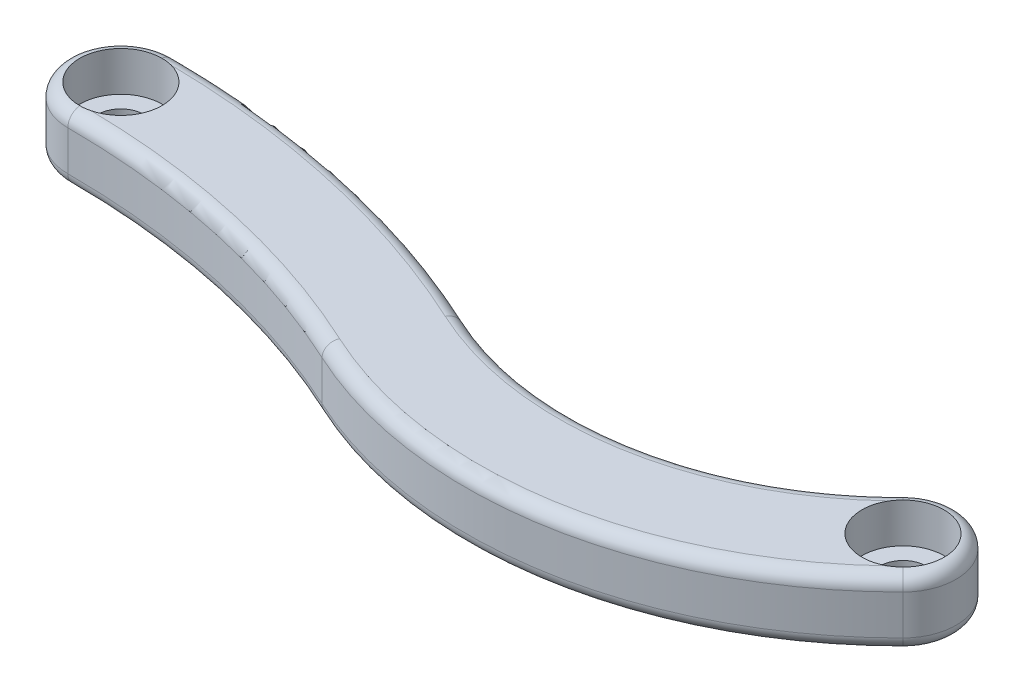
ISO-10303-21;
HEADER;
FILE_DESCRIPTION(('STEP AP214'),'2;1');
FILE_NAME('part.step','',(''),(''),'','','');
FILE_SCHEMA(('AUTOMOTIVE_DESIGN { 1 0 10303 214 1 1 1 1 }'));
ENDSEC;
DATA;
#1=APPLICATION_CONTEXT('core data for automotive mechanical design processes');
#2=APPLICATION_PROTOCOL_DEFINITION('international standard','automotive_design',2000,#1);
#3=PRODUCT_CONTEXT('',#1,'mechanical');
#4=PRODUCT('Part','Part','',(#3));
#5=PRODUCT_RELATED_PRODUCT_CATEGORY('part','',(#4));
#6=PRODUCT_DEFINITION_FORMATION('','',#4);
#7=PRODUCT_DEFINITION_CONTEXT('part definition',#1,'design');
#8=PRODUCT_DEFINITION('design','',#6,#7);
#9=PRODUCT_DEFINITION_SHAPE('','',#8);
#10=(LENGTH_UNIT() NAMED_UNIT(*) SI_UNIT(.MILLI.,.METRE.));
#11=(NAMED_UNIT(*) PLANE_ANGLE_UNIT() SI_UNIT($,.RADIAN.));
#12=(NAMED_UNIT(*) SI_UNIT($,.STERADIAN.) SOLID_ANGLE_UNIT());
#13=UNCERTAINTY_MEASURE_WITH_UNIT(LENGTH_MEASURE(1.E-05),#10,'distance_accuracy_value','');
#14=(GEOMETRIC_REPRESENTATION_CONTEXT(3) GLOBAL_UNCERTAINTY_ASSIGNED_CONTEXT((#13)) GLOBAL_UNIT_ASSIGNED_CONTEXT((#10,
#11,#12)) REPRESENTATION_CONTEXT('',''));
#15=CARTESIAN_POINT('',(0.,0.,0.));
#16=DIRECTION('',(0.,0.,1.));
#17=DIRECTION('',(1.,0.,0.));
#18=AXIS2_PLACEMENT_3D('',#15,#16,#17);
#19=CARTESIAN_POINT('',(-29.5,-25.,0.));
#20=DIRECTION('',(0.,1.,0.));
#21=DIRECTION('',(0.,0.,-1.));
#22=AXIS2_PLACEMENT_3D('',#19,#20,#21);
#23=CYLINDRICAL_SURFACE('',#22,1.75);
#24=CARTESIAN_POINT('',(-29.5,-25.,0.));
#25=DIRECTION('',(0.,1.,0.));
#26=DIRECTION('',(0.,0.,1.));
#27=AXIS2_PLACEMENT_3D('',#24,#25,#26);
#28=CIRCLE('',#27,1.75);
#29=CARTESIAN_POINT('',(-29.5,-25.,1.75));
#30=VERTEX_POINT('',#29);
#31=EDGE_CURVE('E243',#30,#30,#28,.T.);
#32=ORIENTED_EDGE('',*,*,#31,.F.);
#33=EDGE_LOOP('',(#32));
#34=FACE_BOUND('',#33,.T.);
#35=CARTESIAN_POINT('',(-29.5,-23.,0.));
#36=DIRECTION('',(0.,-1.,0.));
#37=DIRECTION('',(0.,0.,-1.));
#38=AXIS2_PLACEMENT_3D('',#35,#36,#37);
#39=CIRCLE('',#38,1.75);
#40=CARTESIAN_POINT('',(-29.5,-23.,-1.75));
#41=VERTEX_POINT('',#40);
#42=EDGE_CURVE('E43',#41,#41,#39,.T.);
#43=ORIENTED_EDGE('',*,*,#42,.F.);
#44=EDGE_LOOP('',(#43));
#45=FACE_BOUND('',#44,.T.);
#46=ADVANCED_FACE('F39',(#34,#45),#23,.F.);
#47=CARTESIAN_POINT('',(29.5,-25.,0.));
#48=DIRECTION('',(0.,1.,0.));
#49=DIRECTION('',(0.,0.,-1.));
#50=AXIS2_PLACEMENT_3D('',#47,#48,#49);
#51=CYLINDRICAL_SURFACE('',#50,1.75);
#52=CARTESIAN_POINT('',(29.5,-25.,0.));
#53=DIRECTION('',(0.,1.,0.));
#54=DIRECTION('',(0.,0.,1.));
#55=AXIS2_PLACEMENT_3D('',#52,#53,#54);
#56=CIRCLE('',#55,1.75);
#57=CARTESIAN_POINT('',(29.5,-25.,1.75));
#58=VERTEX_POINT('',#57);
#59=EDGE_CURVE('E239',#58,#58,#56,.T.);
#60=ORIENTED_EDGE('',*,*,#59,.F.);
#61=EDGE_LOOP('',(#60));
#62=FACE_BOUND('',#61,.T.);
#63=CARTESIAN_POINT('',(29.5,-23.,0.));
#64=DIRECTION('',(0.,-1.,0.));
#65=DIRECTION('',(0.,0.,-1.));
#66=AXIS2_PLACEMENT_3D('',#63,#64,#65);
#67=CIRCLE('',#66,1.75);
#68=CARTESIAN_POINT('',(29.5,-23.,-1.75));
#69=VERTEX_POINT('',#68);
#70=EDGE_CURVE('E221',#69,#69,#67,.T.);
#71=ORIENTED_EDGE('',*,*,#70,.F.);
#72=EDGE_LOOP('',(#71));
#73=FACE_BOUND('',#72,.T.);
#74=ADVANCED_FACE('F228',(#62,#73),#51,.F.);
#75=CARTESIAN_POINT('',(-10.253048327205,-25.,20.9834913295184));
#76=DIRECTION('',(0.,1.,0.));
#77=DIRECTION('',(0.,0.,-1.));
#78=AXIS2_PLACEMENT_3D('',#75,#76,#77);
#79=PLANE('',#78);
#80=CARTESIAN_POINT('',(8.99390334559,-25.,-20.5060966544098));
#81=DIRECTION('',(0.,-1.,0.));
#82=DIRECTION('',(0.,0.,-1.));
#83=AXIS2_PLACEMENT_3D('',#80,#81,#82);
#84=CIRCLE('',#83,32.);
#85=CARTESIAN_POINT('',(-4.47240735810798,-25.,8.52248367655837));
#86=VERTEX_POINT('',#85);
#87=CARTESIAN_POINT('',(31.6213203435597,-25.,2.12132034355962));
#88=VERTEX_POINT('',#87);
#89=EDGE_CURVE('E288',#86,#88,#84,.F.);
#90=ORIENTED_EDGE('',*,*,#89,.F.);
#91=CARTESIAN_POINT('',(-29.5,-25.,62.4730793134466));
#92=DIRECTION('',(0.,-1.,0.));
#93=DIRECTION('',(0.,0.,-1.));
#94=AXIS2_PLACEMENT_3D('',#91,#92,#93);
#95=CIRCLE('',#94,59.4730793134466);
#96=CARTESIAN_POINT('',(-29.5,-25.,3.));
#97=VERTEX_POINT('',#96);
#98=EDGE_CURVE('E284',#97,#86,#95,.T.);
#99=ORIENTED_EDGE('',*,*,#98,.F.);
#100=CARTESIAN_POINT('',(-29.5,-25.,0.));
#101=DIRECTION('',(0.,-1.,0.));
#102=DIRECTION('',(0.,0.,-1.));
#103=AXIS2_PLACEMENT_3D('',#100,#101,#102);
#104=CIRCLE('',#103,3.);
#105=CARTESIAN_POINT('',(-29.5,-25.,-3.));
#106=VERTEX_POINT('',#105);
#107=EDGE_CURVE('E280',#106,#97,#104,.F.);
#108=ORIENTED_EDGE('',*,*,#107,.F.);
#109=CARTESIAN_POINT('',(-29.5,-25.,62.4730793134467));
#110=DIRECTION('',(0.,-1.,0.));
#111=DIRECTION('',(0.,0.,-1.));
#112=AXIS2_PLACEMENT_3D('',#109,#110,#111);
#113=CIRCLE('',#112,65.4730793134467);
#114=CARTESIAN_POINT('',(-1.94747410116464,-25.,3.07962486450185));
#115=VERTEX_POINT('',#114);
#116=EDGE_CURVE('E276',#115,#106,#113,.F.);
#117=ORIENTED_EDGE('',*,*,#116,.F.);
#118=CARTESIAN_POINT('',(8.99390334558998,-25.,-20.5060966544098));
#119=DIRECTION('',(0.,-1.,0.));
#120=DIRECTION('',(0.,0.,-1.));
#121=AXIS2_PLACEMENT_3D('',#118,#119,#120);
#122=CIRCLE('',#121,26.);
#123=CARTESIAN_POINT('',(27.3786796564403,-25.,-2.12132034355963));
#124=VERTEX_POINT('',#123);
#125=EDGE_CURVE('E272',#124,#115,#122,.T.);
#126=ORIENTED_EDGE('',*,*,#125,.F.);
#127=CARTESIAN_POINT('',(29.5,-25.,0.));
#128=DIRECTION('',(0.,-1.,0.));
#129=DIRECTION('',(0.,0.,-1.));
#130=AXIS2_PLACEMENT_3D('',#127,#128,#129);
#131=CIRCLE('',#130,3.);
#132=EDGE_CURVE('E292',#88,#124,#131,.F.);
#133=ORIENTED_EDGE('',*,*,#132,.F.);
#134=EDGE_LOOP('',(#90,#99,#108,#117,#126,#133));
#135=FACE_BOUND('',#134,.T.);
#136=ORIENTED_EDGE('',*,*,#31,.T.);
#137=EDGE_LOOP('',(#136));
#138=FACE_BOUND('',#137,.T.);
#139=ORIENTED_EDGE('',*,*,#59,.T.);
#140=EDGE_LOOP('',(#139));
#141=FACE_BOUND('',#140,.T.);
#142=ADVANCED_FACE('F404',(#135,#138,#141),#79,.F.);
#143=CARTESIAN_POINT('',(-10.253048327205,-20.,20.9834913295184));
#144=DIRECTION('',(0.,1.,0.));
#145=DIRECTION('',(0.,0.,-1.));
#146=AXIS2_PLACEMENT_3D('',#143,#144,#145);
#147=PLANE('',#146);
#148=CARTESIAN_POINT('',(29.5,-20.,0.));
#149=DIRECTION('',(0.,-1.,0.));
#150=DIRECTION('',(0.,0.,-1.));
#151=AXIS2_PLACEMENT_3D('',#148,#149,#150);
#152=CIRCLE('',#151,3.1);
#153=CARTESIAN_POINT('',(31.0338004178894,-20.,2.69396664383253));
#154=VERTEX_POINT('',#153);
#155=CARTESIAN_POINT('',(26.8483729080225,-20.,-1.60588722053914));
#156=VERTEX_POINT('',#155);
#157=EDGE_CURVE('E157',#154,#156,#152,.T.);
#158=ORIENTED_EDGE('',*,*,#157,.T.);
#159=CARTESIAN_POINT('',(8.99390334558998,-20.,-20.5060966544098));
#160=DIRECTION('',(0.,-1.,0.));
#161=DIRECTION('',(0.,0.,-1.));
#162=AXIS2_PLACEMENT_3D('',#159,#160,#161);
#163=CIRCLE('',#162,26.);
#164=CARTESIAN_POINT('',(-1.94747410116464,-20.,3.07962486450185));
#165=VERTEX_POINT('',#164);
#166=EDGE_CURVE('E335',#165,#156,#163,.F.);
#167=ORIENTED_EDGE('',*,*,#166,.F.);
#168=CARTESIAN_POINT('',(-29.5,-20.,62.4730793134467));
#169=DIRECTION('',(0.,-1.,0.));
#170=DIRECTION('',(0.,0.,-1.));
#171=AXIS2_PLACEMENT_3D('',#168,#169,#170);
#172=CIRCLE('',#171,65.4730793134467);
#173=CARTESIAN_POINT('',(-28.700457141666,-20.,-2.995117897127));
#174=VERTEX_POINT('',#173);
#175=EDGE_CURVE('E338',#174,#165,#172,.T.);
#176=ORIENTED_EDGE('',*,*,#175,.F.);
#177=CARTESIAN_POINT('',(-29.4999999999982,-20.,0.));
#178=DIRECTION('',(0.,-1.,0.));
#179=DIRECTION('',(0.,0.,-1.));
#180=AXIS2_PLACEMENT_3D('',#177,#178,#179);
#181=CIRCLE('',#180,3.1);
#182=CARTESIAN_POINT('',(-28.7379740504183,-20.,3.004882102873));
#183=VERTEX_POINT('',#182);
#184=EDGE_CURVE('E177',#174,#183,#181,.T.);
#185=ORIENTED_EDGE('',*,*,#184,.T.);
#186=CARTESIAN_POINT('',(-29.5,-20.,62.4730793134466));
#187=DIRECTION('',(0.,-1.,0.));
#188=DIRECTION('',(0.,0.,-1.));
#189=AXIS2_PLACEMENT_3D('',#186,#187,#188);
#190=CIRCLE('',#189,59.4730793134466);
#191=CARTESIAN_POINT('',(-4.47240735810798,-20.,8.52248367655837));
#192=VERTEX_POINT('',#191);
#193=EDGE_CURVE('E160',#192,#183,#190,.F.);
#194=ORIENTED_EDGE('',*,*,#193,.F.);
#195=CARTESIAN_POINT('',(8.99390334559,-20.,-20.5060966544098));
#196=DIRECTION('',(0.,-1.,0.));
#197=DIRECTION('',(0.,0.,-1.));
#198=AXIS2_PLACEMENT_3D('',#195,#196,#197);
#199=CIRCLE('',#198,32.);
#200=EDGE_CURVE('E144',#154,#192,#199,.T.);
#201=ORIENTED_EDGE('',*,*,#200,.F.);
#202=EDGE_LOOP('',(#158,#167,#176,#185,#194,#201));
#203=FACE_BOUND('',#202,.T.);
#204=ADVANCED_FACE('F155',(#203),#147,.T.);
#205=CARTESIAN_POINT('',(-29.5,-25.,62.4730793134467));
#206=DIRECTION('',(0.,1.,0.));
#207=DIRECTION('',(0.,0.,-1.));
#208=AXIS2_PLACEMENT_3D('',#205,#206,#207);
#209=CYLINDRICAL_SURFACE('',#208,66.4730793134467);
#210=DIRECTION('',(0.,1.,0.));
#211=VECTOR('',#210,1.);
#212=CARTESIAN_POINT('',(-29.5,-25.,-4.));
#213=LINE('',#212,#211);
#214=CARTESIAN_POINT('',(-29.5,-24.,-4.));
#215=VERTEX_POINT('',#214);
#216=CARTESIAN_POINT('',(-29.5,-21.,-4.));
#217=VERTEX_POINT('',#216);
#218=EDGE_CURVE('E268',#215,#217,#213,.T.);
#219=ORIENTED_EDGE('',*,*,#218,.T.);
#220=CARTESIAN_POINT('',(-29.5,-21.,62.4730793134467));
#221=DIRECTION('',(0.,-1.,0.));
#222=DIRECTION('',(0.,0.,-1.));
#223=AXIS2_PLACEMENT_3D('',#220,#221,#222);
#224=CIRCLE('',#223,66.4730793134467);
#225=CARTESIAN_POINT('',(-1.52665189167408,-21.,2.17248172915909));
#226=VERTEX_POINT('',#225);
#227=EDGE_CURVE('E327',#226,#217,#224,.F.);
#228=ORIENTED_EDGE('',*,*,#227,.F.);
#229=DIRECTION('',(0.,1.,0.));
#230=VECTOR('',#229,1.);
#231=CARTESIAN_POINT('',(-1.52665189167408,-25.,2.17248172915909));
#232=LINE('',#231,#230);
#233=CARTESIAN_POINT('',(-1.52665189167408,-24.,2.17248172915909));
#234=VERTEX_POINT('',#233);
#235=EDGE_CURVE('E248',#234,#226,#232,.T.);
#236=ORIENTED_EDGE('',*,*,#235,.F.);
#237=CARTESIAN_POINT('',(-29.5,-24.,62.4730793134467));
#238=DIRECTION('',(0.,-1.,0.));
#239=DIRECTION('',(0.,0.,-1.));
#240=AXIS2_PLACEMENT_3D('',#237,#238,#239);
#241=CIRCLE('',#240,66.4730793134467);
#242=EDGE_CURVE('E331',#215,#234,#241,.T.);
#243=ORIENTED_EDGE('',*,*,#242,.F.);
#244=EDGE_LOOP('',(#219,#228,#236,#243));
#245=FACE_BOUND('',#244,.T.);
#246=ADVANCED_FACE('F413',(#245),#209,.T.);
#247=CARTESIAN_POINT('',(-29.5,-25.,0.));
#248=DIRECTION('',(0.,1.,0.));
#249=DIRECTION('',(0.,0.,-1.));
#250=AXIS2_PLACEMENT_3D('',#247,#248,#249);
#251=CYLINDRICAL_SURFACE('',#250,4.);
#252=DIRECTION('',(0.,1.,0.));
#253=VECTOR('',#252,1.);
#254=CARTESIAN_POINT('',(-29.5,-25.,4.));
#255=LINE('',#254,#253);
#256=CARTESIAN_POINT('',(-29.5,-24.,4.));
#257=VERTEX_POINT('',#256);
#258=CARTESIAN_POINT('',(-29.5,-21.,4.));
#259=VERTEX_POINT('',#258);
#260=EDGE_CURVE('E264',#257,#259,#255,.T.);
#261=ORIENTED_EDGE('',*,*,#260,.T.);
#262=CARTESIAN_POINT('',(-29.5,-21.,0.));
#263=DIRECTION('',(0.,-1.,0.));
#264=DIRECTION('',(0.,0.,-1.));
#265=AXIS2_PLACEMENT_3D('',#262,#263,#264);
#266=CIRCLE('',#265,4.);
#267=EDGE_CURVE('E319',#217,#259,#266,.F.);
#268=ORIENTED_EDGE('',*,*,#267,.F.);
#269=ORIENTED_EDGE('',*,*,#218,.F.);
#270=CARTESIAN_POINT('',(-29.5,-24.,0.));
#271=DIRECTION('',(0.,-1.,0.));
#272=DIRECTION('',(0.,0.,-1.));
#273=AXIS2_PLACEMENT_3D('',#270,#271,#272);
#274=CIRCLE('',#273,4.);
#275=EDGE_CURVE('E323',#257,#215,#274,.T.);
#276=ORIENTED_EDGE('',*,*,#275,.F.);
#277=EDGE_LOOP('',(#261,#268,#269,#276));
#278=FACE_BOUND('',#277,.T.);
#279=ADVANCED_FACE('F430',(#278),#251,.T.);
#280=CARTESIAN_POINT('',(-29.5,-25.,62.4730793134466));
#281=DIRECTION('',(0.,1.,0.));
#282=DIRECTION('',(0.,0.,-1.));
#283=AXIS2_PLACEMENT_3D('',#280,#281,#282);
#284=CYLINDRICAL_SURFACE('',#283,58.4730793134466);
#285=DIRECTION('',(0.,1.,0.));
#286=VECTOR('',#285,1.);
#287=CARTESIAN_POINT('',(-4.89322956759855,-25.,9.42962681190113));
#288=LINE('',#287,#286);
#289=CARTESIAN_POINT('',(-4.89322956759855,-24.,9.42962681190113));
#290=VERTEX_POINT('',#289);
#291=CARTESIAN_POINT('',(-4.89322956759855,-21.,9.42962681190113));
#292=VERTEX_POINT('',#291);
#293=EDGE_CURVE('E260',#290,#292,#288,.T.);
#294=ORIENTED_EDGE('',*,*,#293,.T.);
#295=CARTESIAN_POINT('',(-29.5,-21.,62.4730793134466));
#296=DIRECTION('',(0.,-1.,0.));
#297=DIRECTION('',(0.,0.,-1.));
#298=AXIS2_PLACEMENT_3D('',#295,#296,#297);
#299=CIRCLE('',#298,58.4730793134466);
#300=EDGE_CURVE('E311',#259,#292,#299,.T.);
#301=ORIENTED_EDGE('',*,*,#300,.F.);
#302=ORIENTED_EDGE('',*,*,#260,.F.);
#303=CARTESIAN_POINT('',(-29.5,-24.,62.4730793134466));
#304=DIRECTION('',(0.,-1.,0.));
#305=DIRECTION('',(0.,0.,-1.));
#306=AXIS2_PLACEMENT_3D('',#303,#304,#305);
#307=CIRCLE('',#306,58.4730793134466);
#308=EDGE_CURVE('E315',#290,#257,#307,.F.);
#309=ORIENTED_EDGE('',*,*,#308,.F.);
#310=EDGE_LOOP('',(#294,#301,#302,#309));
#311=FACE_BOUND('',#310,.T.);
#312=ADVANCED_FACE('F426',(#311),#284,.F.);
#313=CARTESIAN_POINT('',(8.99390334559,-25.,-20.5060966544098));
#314=DIRECTION('',(0.,1.,0.));
#315=DIRECTION('',(0.,0.,-1.));
#316=AXIS2_PLACEMENT_3D('',#313,#314,#315);
#317=CYLINDRICAL_SURFACE('',#316,33.);
#318=DIRECTION('',(0.,1.,0.));
#319=VECTOR('',#318,1.);
#320=CARTESIAN_POINT('',(32.3284271247462,-25.,2.82842712474617));
#321=LINE('',#320,#319);
#322=CARTESIAN_POINT('',(32.3284271247462,-24.,2.82842712474617));
#323=VERTEX_POINT('',#322);
#324=CARTESIAN_POINT('',(32.3284271247462,-21.,2.82842712474617));
#325=VERTEX_POINT('',#324);
#326=EDGE_CURVE('E256',#323,#325,#321,.T.);
#327=ORIENTED_EDGE('',*,*,#326,.T.);
#328=CARTESIAN_POINT('',(8.99390334559,-21.,-20.5060966544098));
#329=DIRECTION('',(0.,-1.,0.));
#330=DIRECTION('',(0.,0.,-1.));
#331=AXIS2_PLACEMENT_3D('',#328,#329,#330);
#332=CIRCLE('',#331,33.);
#333=EDGE_CURVE('E304',#292,#325,#332,.F.);
#334=ORIENTED_EDGE('',*,*,#333,.F.);
#335=ORIENTED_EDGE('',*,*,#293,.F.);
#336=CARTESIAN_POINT('',(8.99390334559,-24.,-20.5060966544098));
#337=DIRECTION('',(0.,-1.,0.));
#338=DIRECTION('',(0.,0.,-1.));
#339=AXIS2_PLACEMENT_3D('',#336,#337,#338);
#340=CIRCLE('',#339,33.);
#341=EDGE_CURVE('E307',#323,#290,#340,.T.);
#342=ORIENTED_EDGE('',*,*,#341,.F.);
#343=EDGE_LOOP('',(#327,#334,#335,#342));
#344=FACE_BOUND('',#343,.T.);
#345=ADVANCED_FACE('F422',(#344),#317,.T.);
#346=CARTESIAN_POINT('',(29.5,-25.,0.));
#347=DIRECTION('',(0.,1.,0.));
#348=DIRECTION('',(0.,0.,-1.));
#349=AXIS2_PLACEMENT_3D('',#346,#347,#348);
#350=CYLINDRICAL_SURFACE('',#349,4.);
#351=DIRECTION('',(0.,1.,0.));
#352=VECTOR('',#351,1.);
#353=CARTESIAN_POINT('',(26.6715728752538,-25.,-2.82842712474617));
#354=LINE('',#353,#352);
#355=CARTESIAN_POINT('',(26.6715728752538,-24.,-2.82842712474617));
#356=VERTEX_POINT('',#355);
#357=CARTESIAN_POINT('',(26.6715728752538,-21.,-2.82842712474617));
#358=VERTEX_POINT('',#357);
#359=EDGE_CURVE('E252',#356,#358,#354,.T.);
#360=ORIENTED_EDGE('',*,*,#359,.T.);
#361=CARTESIAN_POINT('',(29.5,-21.,0.));
#362=DIRECTION('',(0.,-1.,0.));
#363=DIRECTION('',(0.,0.,-1.));
#364=AXIS2_PLACEMENT_3D('',#361,#362,#363);
#365=CIRCLE('',#364,4.);
#366=EDGE_CURVE('E296',#325,#358,#365,.F.);
#367=ORIENTED_EDGE('',*,*,#366,.F.);
#368=ORIENTED_EDGE('',*,*,#326,.F.);
#369=CARTESIAN_POINT('',(29.5,-24.,0.));
#370=DIRECTION('',(0.,-1.,0.));
#371=DIRECTION('',(0.,0.,-1.));
#372=AXIS2_PLACEMENT_3D('',#369,#370,#371);
#373=CIRCLE('',#372,4.);
#374=EDGE_CURVE('E300',#356,#323,#373,.T.);
#375=ORIENTED_EDGE('',*,*,#374,.F.);
#376=EDGE_LOOP('',(#360,#367,#368,#375));
#377=FACE_BOUND('',#376,.T.);
#378=ADVANCED_FACE('F418',(#377),#350,.T.);
#379=CARTESIAN_POINT('',(8.99390334558998,-25.,-20.5060966544098));
#380=DIRECTION('',(0.,1.,0.));
#381=DIRECTION('',(0.,0.,-1.));
#382=AXIS2_PLACEMENT_3D('',#379,#380,#381);
#383=CYLINDRICAL_SURFACE('',#382,25.);
#384=ORIENTED_EDGE('',*,*,#235,.T.);
#385=CARTESIAN_POINT('',(8.99390334558998,-21.,-20.5060966544098));
#386=DIRECTION('',(0.,-1.,0.));
#387=DIRECTION('',(0.,0.,-1.));
#388=AXIS2_PLACEMENT_3D('',#385,#386,#387);
#389=CIRCLE('',#388,25.);
#390=EDGE_CURVE('E162',#358,#226,#389,.T.);
#391=ORIENTED_EDGE('',*,*,#390,.F.);
#392=ORIENTED_EDGE('',*,*,#359,.F.);
#393=CARTESIAN_POINT('',(8.99390334558998,-24.,-20.5060966544098));
#394=DIRECTION('',(0.,-1.,0.));
#395=DIRECTION('',(0.,0.,-1.));
#396=AXIS2_PLACEMENT_3D('',#393,#394,#395);
#397=CIRCLE('',#396,25.);
#398=EDGE_CURVE('E347',#234,#356,#397,.F.);
#399=ORIENTED_EDGE('',*,*,#398,.F.);
#400=EDGE_LOOP('',(#384,#391,#392,#399));
#401=FACE_BOUND('',#400,.T.);
#402=ADVANCED_FACE('F414',(#401),#383,.F.);
#403=CARTESIAN_POINT('',(-29.5,-24.,0.));
#404=DIRECTION('',(0.,1.,0.));
#405=DIRECTION('',(0.,0.,-1.));
#406=AXIS2_PLACEMENT_3D('',#403,#404,#405);
#407=TOROIDAL_SURFACE('',#406,3.,1.);
#408=CARTESIAN_POINT('',(-29.5,-24.,-3.));
#409=DIRECTION('',(-1.,0.,0.));
#410=DIRECTION('',(0.,0.,-1.));
#411=AXIS2_PLACEMENT_3D('',#408,#409,#410);
#412=CIRCLE('',#411,1.);
#413=EDGE_CURVE('E364',#215,#106,#412,.T.);
#414=ORIENTED_EDGE('',*,*,#413,.T.);
#415=ORIENTED_EDGE('',*,*,#107,.T.);
#416=CARTESIAN_POINT('',(-29.5,-24.,3.));
#417=DIRECTION('',(-1.,0.,0.));
#418=DIRECTION('',(0.,0.,-1.));
#419=AXIS2_PLACEMENT_3D('',#416,#417,#418);
#420=CIRCLE('',#419,1.);
#421=EDGE_CURVE('E244',#97,#257,#420,.T.);
#422=ORIENTED_EDGE('',*,*,#421,.T.);
#423=ORIENTED_EDGE('',*,*,#275,.T.);
#424=EDGE_LOOP('',(#414,#415,#422,#423));
#425=FACE_BOUND('',#424,.T.);
#426=ADVANCED_FACE('F417',(#425),#407,.T.);
#427=CARTESIAN_POINT('',(-29.5,-24.,62.4730793134466));
#428=DIRECTION('',(0.,1.,0.));
#429=DIRECTION('',(0.,0.,-1.));
#430=AXIS2_PLACEMENT_3D('',#427,#428,#429);
#431=TOROIDAL_SURFACE('',#430,59.4730793134466,1.);
#432=ORIENTED_EDGE('',*,*,#421,.F.);
#433=ORIENTED_EDGE('',*,*,#98,.T.);
#434=CARTESIAN_POINT('',(-4.47240735810798,-24.,8.52248367655837));
#435=DIRECTION('',(-0.907143135342753,0.,-0.420822209490563));
#436=DIRECTION('',(0.420822209490563,0.,-0.907143135342754));
#437=AXIS2_PLACEMENT_3D('',#434,#435,#436);
#438=CIRCLE('',#437,1.);
#439=EDGE_CURVE('E361',#86,#290,#438,.T.);
#440=ORIENTED_EDGE('',*,*,#439,.T.);
#441=ORIENTED_EDGE('',*,*,#308,.T.);
#442=EDGE_LOOP('',(#432,#433,#440,#441));
#443=FACE_BOUND('',#442,.T.);
#444=ADVANCED_FACE('F453',(#443),#431,.T.);
#445=CARTESIAN_POINT('',(-29.5,-24.,62.4730793134467));
#446=DIRECTION('',(0.,1.,0.));
#447=DIRECTION('',(0.,0.,-1.));
#448=AXIS2_PLACEMENT_3D('',#445,#446,#447);
#449=TOROIDAL_SURFACE('',#448,65.4730793134467,1.);
#450=ORIENTED_EDGE('',*,*,#413,.F.);
#451=ORIENTED_EDGE('',*,*,#242,.T.);
#452=CARTESIAN_POINT('',(-1.94747410116463,-24.,3.07962486450183));
#453=DIRECTION('',(-0.907143135342754,0.,-0.420822209490561));
#454=DIRECTION('',(0.420822209490561,0.,-0.907143135342754));
#455=AXIS2_PLACEMENT_3D('',#452,#453,#454);
#456=CIRCLE('',#455,1.);
#457=EDGE_CURVE('E358',#234,#115,#456,.T.);
#458=ORIENTED_EDGE('',*,*,#457,.T.);
#459=ORIENTED_EDGE('',*,*,#116,.T.);
#460=EDGE_LOOP('',(#450,#451,#458,#459));
#461=FACE_BOUND('',#460,.T.);
#462=ADVANCED_FACE('F449',(#461),#449,.T.);
#463=CARTESIAN_POINT('',(8.99390334559,-24.,-20.5060966544098));
#464=DIRECTION('',(0.,1.,0.));
#465=DIRECTION('',(0.,0.,-1.));
#466=AXIS2_PLACEMENT_3D('',#463,#464,#465);
#467=TOROIDAL_SURFACE('',#466,32.,1.);
#468=ORIENTED_EDGE('',*,*,#439,.F.);
#469=ORIENTED_EDGE('',*,*,#89,.T.);
#470=CARTESIAN_POINT('',(31.6213203435597,-24.,2.12132034355962));
#471=DIRECTION('',(-0.707106781186543,0.,0.707106781186552));
#472=DIRECTION('',(-0.707106781186552,0.,-0.707106781186543));
#473=AXIS2_PLACEMENT_3D('',#470,#471,#472);
#474=CIRCLE('',#473,1.);
#475=EDGE_CURVE('E354',#88,#323,#474,.T.);
#476=ORIENTED_EDGE('',*,*,#475,.T.);
#477=ORIENTED_EDGE('',*,*,#341,.T.);
#478=EDGE_LOOP('',(#468,#469,#476,#477));
#479=FACE_BOUND('',#478,.T.);
#480=ADVANCED_FACE('F445',(#479),#467,.T.);
#481=CARTESIAN_POINT('',(8.99390334558998,-24.,-20.5060966544098));
#482=DIRECTION('',(0.,1.,0.));
#483=DIRECTION('',(0.,0.,-1.));
#484=AXIS2_PLACEMENT_3D('',#481,#482,#483);
#485=TOROIDAL_SURFACE('',#484,26.,1.);
#486=ORIENTED_EDGE('',*,*,#457,.F.);
#487=ORIENTED_EDGE('',*,*,#398,.T.);
#488=CARTESIAN_POINT('',(27.3786796564403,-24.,-2.12132034355963));
#489=DIRECTION('',(-0.707106781186543,0.,0.707106781186552));
#490=DIRECTION('',(-0.707106781186552,0.,-0.707106781186543));
#491=AXIS2_PLACEMENT_3D('',#488,#489,#490);
#492=CIRCLE('',#491,1.);
#493=EDGE_CURVE('E351',#356,#124,#492,.T.);
#494=ORIENTED_EDGE('',*,*,#493,.T.);
#495=ORIENTED_EDGE('',*,*,#125,.T.);
#496=EDGE_LOOP('',(#486,#487,#494,#495));
#497=FACE_BOUND('',#496,.T.);
#498=ADVANCED_FACE('F441',(#497),#485,.T.);
#499=CARTESIAN_POINT('',(29.5,-24.,0.));
#500=DIRECTION('',(0.,1.,0.));
#501=DIRECTION('',(0.,0.,-1.));
#502=AXIS2_PLACEMENT_3D('',#499,#500,#501);
#503=TOROIDAL_SURFACE('',#502,3.,1.);
#504=ORIENTED_EDGE('',*,*,#475,.F.);
#505=ORIENTED_EDGE('',*,*,#132,.T.);
#506=ORIENTED_EDGE('',*,*,#493,.F.);
#507=ORIENTED_EDGE('',*,*,#374,.T.);
#508=EDGE_LOOP('',(#504,#505,#506,#507));
#509=FACE_BOUND('',#508,.T.);
#510=ADVANCED_FACE('F438',(#509),#503,.T.);
#511=CARTESIAN_POINT('',(-29.5,-21.,0.));
#512=DIRECTION('',(0.,1.,0.));
#513=DIRECTION('',(0.,0.,-1.));
#514=AXIS2_PLACEMENT_3D('',#511,#512,#513);
#515=TOROIDAL_SURFACE('',#514,3.,1.);
#516=CARTESIAN_POINT('',(-29.5,-20.0050125628934,0.));
#517=DIRECTION('',(0.,1.,0.));
#518=DIRECTION('',(0.,0.,1.));
#519=AXIS2_PLACEMENT_3D('',#516,#517,#518);
#520=CIRCLE('',#519,3.1);
#521=CARTESIAN_POINT('',(-29.5,-20.0050125628934,3.1));
#522=VERTEX_POINT('',#521);
#523=CARTESIAN_POINT('',(-29.5,-20.0050125628934,-3.10000000000006));
#524=VERTEX_POINT('',#523);
#525=EDGE_CURVE('E150',#522,#524,#520,.F.);
#526=ORIENTED_EDGE('',*,*,#525,.T.);
#527=CARTESIAN_POINT('',(-29.5,-21.,-3.));
#528=DIRECTION('',(-1.,0.,0.));
#529=DIRECTION('',(0.,0.,-1.));
#530=AXIS2_PLACEMENT_3D('',#527,#528,#529);
#531=CIRCLE('',#530,1.);
#532=EDGE_CURVE('E380',#524,#217,#531,.T.);
#533=ORIENTED_EDGE('',*,*,#532,.T.);
#534=ORIENTED_EDGE('',*,*,#267,.T.);
#535=CARTESIAN_POINT('',(-29.5,-21.,3.));
#536=DIRECTION('',(-1.,0.,0.));
#537=DIRECTION('',(0.,0.,-1.));
#538=AXIS2_PLACEMENT_3D('',#535,#536,#537);
#539=CIRCLE('',#538,1.);
#540=EDGE_CURVE('E355',#259,#522,#539,.T.);
#541=ORIENTED_EDGE('',*,*,#540,.T.);
#542=EDGE_LOOP('',(#526,#533,#534,#541));
#543=FACE_BOUND('',#542,.T.);
#544=ADVANCED_FACE('F41',(#543),#515,.T.);
#545=CARTESIAN_POINT('',(-29.5,-21.,62.4730793134466));
#546=DIRECTION('',(0.,1.,0.));
#547=DIRECTION('',(0.,0.,-1.));
#548=AXIS2_PLACEMENT_3D('',#545,#546,#547);
#549=TOROIDAL_SURFACE('',#548,59.4730793134466,1.);
#550=CARTESIAN_POINT('',(-28.7182072141462,-20.0000142483967,2.99979999999822));
#551=CARTESIAN_POINT('',(-28.782087313141,-19.9999470029924,3.01645087845939));
#552=CARTESIAN_POINT('',(-28.8464972747781,-20.0002976206026,3.03105520000387));
#553=CARTESIAN_POINT('',(-28.9758524707309,-20.0013553124528,3.0560738427534));
#554=CARTESIAN_POINT('',(-29.0407944762321,-20.0020609357715,3.06650491114906));
#555=CARTESIAN_POINT('',(-29.1712120337027,-20.0033565493123,3.08321591663286));
#556=CARTESIAN_POINT('',(-29.2366875898616,-20.0039465386256,3.08949582109427));
#557=CARTESIAN_POINT('',(-29.3681741410356,-20.0047903790324,3.09789990371887));
#558=CARTESIAN_POINT('',(-29.4341862306772,-20.0050428539229,3.10000708444189));
#559=CARTESIAN_POINT('',(-29.5002,-20.0050125622111,3.09999999354832));
#560=B_SPLINE_CURVE_WITH_KNOTS('',3,(#550,#551,#552,#553,#554,#555,#556,#557,#558,#559),
.UNSPECIFIED.,.F.,.F.,(4,2,2,2,4),(0.,0.198003677729509,0.395204602349082,0.592407076881653,
0.790411209577516),.UNSPECIFIED.);
#561=EDGE_CURVE('E232',#183,#522,#560,.T.);
#562=ORIENTED_EDGE('',*,*,#561,.T.);
#563=ORIENTED_EDGE('',*,*,#540,.F.);
#564=ORIENTED_EDGE('',*,*,#300,.T.);
#565=CARTESIAN_POINT('',(-4.47240735810799,-21.,8.52248367655838));
#566=DIRECTION('',(-0.907143135342754,0.,-0.420822209490562));
#567=DIRECTION('',(0.420822209490562,0.,-0.907143135342754));
#568=AXIS2_PLACEMENT_3D('',#565,#566,#567);
#569=CIRCLE('',#568,1.);
#570=EDGE_CURVE('E377',#292,#192,#569,.T.);
#571=ORIENTED_EDGE('',*,*,#570,.T.);
#572=ORIENTED_EDGE('',*,*,#193,.T.);
#573=EDGE_LOOP('',(#562,#563,#564,#571,#572));
#574=FACE_BOUND('',#573,.T.);
#575=ADVANCED_FACE('F211',(#574),#549,.T.);
#576=CARTESIAN_POINT('',(-29.5,-21.,62.4730793134467));
#577=DIRECTION('',(0.,1.,0.));
#578=DIRECTION('',(0.,0.,-1.));
#579=AXIS2_PLACEMENT_3D('',#576,#577,#578);
#580=TOROIDAL_SURFACE('',#579,65.4730793134467,1.);
#581=CARTESIAN_POINT('',(-29.5002,-20.0050125622756,-3.09999999354845));
#582=CARTESIAN_POINT('',(-29.4579402171375,-20.0050160945624,-3.10000268366933));
#583=CARTESIAN_POINT('',(-29.4156853299843,-20.0049299121712,-3.09914117446494));
#584=CARTESIAN_POINT('',(-29.331247986286,-20.0046066108502,-3.09569193495469));
#585=CARTESIAN_POINT('',(-29.2890655274698,-20.0043694967433,-3.09310425980506));
#586=CARTESIAN_POINT('',(-29.1627018732111,-20.003474378739,-3.08275395498914));
#587=CARTESIAN_POINT('',(-29.0787193130851,-20.0026326179563,-3.07240404641552));
#588=CARTESIAN_POINT('',(-28.9112499517857,-20.0010350820312,-3.04477164070717));
#589=CARTESIAN_POINT('',(-28.8277719298792,-20.0002800179233,-3.02743644220288));
#590=CARTESIAN_POINT('',(-28.6625395368082,-19.9998419760126,-2.98595199826528));
#591=CARTESIAN_POINT('',(-28.5807845665506,-20.0001586191835,-2.96180516464295));
#592=CARTESIAN_POINT('',(-28.4408772390583,-20.0028069950502,-2.91413578596202));
#593=CARTESIAN_POINT('',(-28.3821932609866,-20.0045845109146,-2.89213228020112));
#594=CARTESIAN_POINT('',(-28.2663495260906,-20.01011849037,-2.84464808658212));
#595=CARTESIAN_POINT('',(-28.2091894236709,-20.0138745011831,-2.81916819528193));
#596=CARTESIAN_POINT('',(-28.0969005226442,-20.0241310860751,-2.76499232193545));
#597=CARTESIAN_POINT('',(-28.0417653396457,-20.0306220505481,-2.73630785642654));
#598=CARTESIAN_POINT('',(-27.9337517708257,-20.0472534322261,-2.67594705733091));
#599=CARTESIAN_POINT('',(-27.8808722356615,-20.0573919653909,-2.64427227451978));
#600=CARTESIAN_POINT('',(-27.7651787820256,-20.0854321482758,-2.57025043675208));
#601=CARTESIAN_POINT('',(-27.7031154443791,-20.1046290093273,-2.52719311985266));
#602=CARTESIAN_POINT('',(-27.5846380902309,-20.1525821781239,-2.43861257905718));
#603=CARTESIAN_POINT('',(-27.5282175091504,-20.1813272055269,-2.39309231779145));
#604=CARTESIAN_POINT('',(-27.4350857334753,-20.2425737421706,-2.31279017844528));
#605=CARTESIAN_POINT('',(-27.3968377981557,-20.2726590731436,-2.27796556139681));
#606=CARTESIAN_POINT('',(-27.3258115920594,-20.340541762651,-2.21027148573173));
#607=CARTESIAN_POINT('',(-27.2930259759801,-20.3783286101499,-2.17739944038166));
#608=CARTESIAN_POINT('',(-27.2395168576386,-20.4539789515459,-2.1216568364387));
#609=CARTESIAN_POINT('',(-27.2176840561416,-20.4905206259185,-2.098063288219));
#610=CARTESIAN_POINT('',(-27.178929686265,-20.5684443152621,-2.05510838697317));
#611=CARTESIAN_POINT('',(-27.162008465487,-20.6098266725266,-2.03574733351251));
#612=CARTESIAN_POINT('',(-27.1334816193913,-20.6968170164128,-2.00251795520699));
#613=CARTESIAN_POINT('',(-27.1219120670356,-20.7424512574867,-1.98868698824553));
#614=CARTESIAN_POINT('',(-27.1046238383691,-20.8362676981072,-1.96783174816903));
#615=CARTESIAN_POINT('',(-27.0988914198566,-20.8844436309881,-1.96079148995026));
#616=CARTESIAN_POINT('',(-27.0955176663121,-20.9441389967127,-1.9566461451403));
#617=CARTESIAN_POINT('',(-27.0950444347872,-20.9553466831772,-1.95606451395707));
#618=CARTESIAN_POINT('',(-27.0944155430238,-20.977767995691,-1.95529135026463));
#619=CARTESIAN_POINT('',(-27.0942594193536,-20.988981589082,-1.95509924848526));
#620=CARTESIAN_POINT('',(-27.0942607525421,-21.0002,-1.95510068110348));
#621=B_SPLINE_CURVE_WITH_KNOTS('',3,(#581,#582,#583,#584,#585,#586,#587,#588,#589,#590,#591,
#592,#593,#594,#595,#596,#597,#598,#599,#600,#601,#602,#603,#604,#605,#606,#607,#608,#609,#610,
#611,#612,#613,#614,#615,#616,#617,#618,#619,#620),.UNSPECIFIED.,.F.,.F.,(4,2,2,2,2,2,2,2,2,2,2,
2,2,2,2,2,2,2,2,4),(0.,0.126760580950912,0.253517111712132,0.507074776595872,0.762582367931674,
1.01799960442743,1.20596744504193,1.39389228795139,1.5811622680412,1.76833565808323,
2.00148823236928,2.23436633074631,2.41325074780592,2.59189263875198,2.73730347874738,
2.88272460723126,3.02911215508037,3.17515426437967,3.20884621289801,3.2424888873836),.UNSPECIFIED.);
#622=EDGE_CURVE('E11',#524,#174,#621,.T.);
#623=ORIENTED_EDGE('',*,*,#622,.T.);
#624=ORIENTED_EDGE('',*,*,#175,.T.);
#625=CARTESIAN_POINT('',(-1.94747410116463,-21.,3.07962486450183));
#626=DIRECTION('',(-0.907143135342754,0.,-0.420822209490561));
#627=DIRECTION('',(0.420822209490561,0.,-0.907143135342754));
#628=AXIS2_PLACEMENT_3D('',#625,#626,#627);
#629=CIRCLE('',#628,1.);
#630=EDGE_CURVE('E374',#165,#226,#629,.T.);
#631=ORIENTED_EDGE('',*,*,#630,.T.);
#632=ORIENTED_EDGE('',*,*,#227,.T.);
#633=ORIENTED_EDGE('',*,*,#532,.F.);
#634=EDGE_LOOP('',(#623,#624,#631,#632,#633));
#635=FACE_BOUND('',#634,.T.);
#636=ADVANCED_FACE('F208',(#635),#580,.T.);
#637=CARTESIAN_POINT('',(8.99390334559,-21.,-20.5060966544098));
#638=DIRECTION('',(0.,1.,0.));
#639=DIRECTION('',(0.,0.,-1.));
#640=AXIS2_PLACEMENT_3D('',#637,#638,#639);
#641=TOROIDAL_SURFACE('',#640,32.,1.);
#642=CARTESIAN_POINT('',(31.7607185778282,-20.0048708506395,2.12112034355962));
#643=CARTESIAN_POINT('',(31.7317787677159,-20.0049943289136,2.15196473747236));
#644=CARTESIAN_POINT('',(31.702210838507,-20.0050363304939,2.18221343079419));
#645=CARTESIAN_POINT('',(31.6418633794252,-20.0049656020513,2.24147498376102));
#646=CARTESIAN_POINT('',(31.6110838867131,-20.0048528767704,2.27048788125338));
#647=CARTESIAN_POINT('',(31.5169945966186,-20.0042949596879,2.35560693623523));
#648=CARTESIAN_POINT('',(31.4519318571881,-20.0036300345002,2.40979572604254));
#649=CARTESIAN_POINT('',(31.317182534657,-20.0020999974176,2.51298570527547));
#650=CARTESIAN_POINT('',(31.2474695164334,-20.0012336564201,2.56195223592784));
#651=CARTESIAN_POINT('',(31.1042551899772,-20.0000559016412,2.65397927185878));
#652=CARTESIAN_POINT('',(31.0307547239954,-19.9997443650259,2.69704108249482));
#653=CARTESIAN_POINT('',(30.89424614155,-20.0006700140783,2.76964094304478));
#654=CARTESIAN_POINT('',(30.8317831764465,-20.0016338852314,2.80021122520114));
#655=CARTESIAN_POINT('',(30.704993700586,-20.0054162119508,2.85706400912213));
#656=CARTESIAN_POINT('',(30.6406675464323,-20.0082343148412,2.8833473250842));
#657=CARTESIAN_POINT('',(30.5107596132674,-20.0166252906864,2.93140643082841));
#658=CARTESIAN_POINT('',(30.4451827504163,-20.0221889234119,2.95319699481724));
#659=CARTESIAN_POINT('',(30.3131490537291,-20.0371506681949,2.99224405435207));
#660=CARTESIAN_POINT('',(30.2466927719051,-20.0465464758712,3.00950326447854));
#661=CARTESIAN_POINT('',(30.1020857468904,-20.0725270121211,3.04201994339809));
#662=CARTESIAN_POINT('',(30.0239033316334,-20.0900750864632,3.05641279758031));
#663=CARTESIAN_POINT('',(29.8693039904003,-20.134644171625,3.07890958554171));
#664=CARTESIAN_POINT('',(29.792885164001,-20.1616544241727,3.08702062810484));
#665=CARTESIAN_POINT('',(29.6618126575618,-20.2201973874748,3.0963058462121));
#666=CARTESIAN_POINT('',(29.6061671081229,-20.2492974171886,3.09863949416827));
#667=CARTESIAN_POINT('',(29.4999355651938,-20.3157186085834,3.10045255739805));
#668=CARTESIAN_POINT('',(29.4493422634238,-20.3530276376265,3.0999361581035));
#669=CARTESIAN_POINT('',(29.3658220569829,-20.4274637395346,3.0973154993957));
#670=CARTESIAN_POINT('',(29.3314249483081,-20.4629476018348,3.09557164906303));
#671=CARTESIAN_POINT('',(29.2689012941467,-20.5391003598139,3.09153275347613));
#672=CARTESIAN_POINT('',(29.2407741821991,-20.5797687865726,3.08923775805388));
#673=CARTESIAN_POINT('',(29.1920812384107,-20.6658663606189,3.08476800341963));
#674=CARTESIAN_POINT('',(29.1715761452384,-20.7113301927525,3.08259432264179));
#675=CARTESIAN_POINT('',(29.1397227133046,-20.8053599007416,3.07903620075452));
#676=CARTESIAN_POINT('',(29.1283545917427,-20.85391882773,3.07765005643948));
#677=CARTESIAN_POINT('',(29.1197889547514,-20.9191632434311,3.07659576444187));
#678=CARTESIAN_POINT('',(29.118202380348,-20.9353414629153,3.07639907400524));
#679=CARTESIAN_POINT('',(29.1160910842915,-20.9677435282997,3.07613646179775));
#680=CARTESIAN_POINT('',(29.1155647594528,-20.9839672681117,3.07607034259531));
#681=CARTESIAN_POINT('',(29.1155677251405,-21.0002,3.07607084216967));
#682=B_SPLINE_CURVE_WITH_KNOTS('',3,(#642,#643,#644,#645,#646,#647,#648,#649,#650,#651,#652,
#653,#654,#655,#656,#657,#658,#659,#660,#661,#662,#663,#664,#665,#666,#667,#668,#669,#670,#671,
#672,#673,#674,#675,#676,#677,#678,#679,#680,#681),.UNSPECIFIED.,.F.,.F.,(4,2,2,2,2,2,2,2,2,2,2,
2,2,2,2,2,2,2,2,4),(0.,0.126867662144615,0.253731436055735,0.507449674040606,0.762758820531086,
1.01801143447421,1.22649385893186,1.43493664136663,1.64268263423583,1.85030388807636,
2.0938894898547,2.33719903466105,2.52507071849973,2.71266657719178,2.86043255524792,
3.00818517801758,3.15709118414689,3.30567391316595,3.35441890469425,3.40309013424782),.UNSPECIFIED.);
#683=CARTESIAN_POINT('',(31.6920310216783,-20.0050125628934,2.19203102167828));
#684=VERTEX_POINT('',#683);
#685=EDGE_CURVE('E141',#684,#154,#682,.T.);
#686=ORIENTED_EDGE('',*,*,#685,.T.);
#687=ORIENTED_EDGE('',*,*,#200,.T.);
#688=ORIENTED_EDGE('',*,*,#570,.F.);
#689=ORIENTED_EDGE('',*,*,#333,.T.);
#690=CARTESIAN_POINT('',(31.6213203435597,-21.,2.12132034355962));
#691=DIRECTION('',(-0.707106781186543,0.,0.707106781186552));
#692=DIRECTION('',(-0.707106781186552,0.,-0.707106781186543));
#693=AXIS2_PLACEMENT_3D('',#690,#691,#692);
#694=CIRCLE('',#693,1.);
#695=EDGE_CURVE('E147',#325,#684,#694,.T.);
#696=ORIENTED_EDGE('',*,*,#695,.T.);
#697=EDGE_LOOP('',(#686,#687,#688,#689,#696));
#698=FACE_BOUND('',#697,.T.);
#699=ADVANCED_FACE('F143',(#698),#641,.T.);
#700=CARTESIAN_POINT('',(8.99390334558998,-21.,-20.5060966544098));
#701=DIRECTION('',(0.,1.,0.));
#702=DIRECTION('',(0.,0.,-1.));
#703=AXIS2_PLACEMENT_3D('',#700,#701,#702);
#704=TOROIDAL_SURFACE('',#703,26.,1.);
#705=CARTESIAN_POINT('',(26.4028104802687,-21.0002,0.13197378098063));
#706=CARTESIAN_POINT('',(26.4028124117598,-20.9770202641037,0.131980511572717));
#707=CARTESIAN_POINT('',(26.4027674081664,-20.9538522617926,0.13096690487754));
#708=CARTESIAN_POINT('',(26.4025982398323,-20.9076994135136,0.126919208000246));
#709=CARTESIAN_POINT('',(26.4024740947082,-20.8847145235873,0.123885618495082));
#710=CARTESIAN_POINT('',(26.4020064229765,-20.816470038138,0.111822104960477));
#711=CARTESIAN_POINT('',(26.4015674005491,-20.7717010728419,0.0998290387111261));
#712=CARTESIAN_POINT('',(26.4007169679986,-20.6848907244359,0.0684592697022799));
#713=CARTESIAN_POINT('',(26.4003055476777,-20.6428483341634,0.0490853117407801));
#714=CARTESIAN_POINT('',(26.3999198151006,-20.5624535358069,0.00377720782776236));
#715=CARTESIAN_POINT('',(26.3999456935665,-20.5241027450989,-0.022159795651459));
#716=CARTESIAN_POINT('',(26.4009044046618,-20.4505963400911,-0.0805102568854942));
#717=CARTESIAN_POINT('',(26.4018677439845,-20.4155917773586,-0.113112367051897));
#718=CARTESIAN_POINT('',(26.405204478985,-20.3506464016854,-0.182937548935713));
#719=CARTESIAN_POINT('',(26.4075786249611,-20.3207082940907,-0.220163071147788));
#720=CARTESIAN_POINT('',(26.4155825088049,-20.2535636235962,-0.315519634837231));
#721=CARTESIAN_POINT('',(26.4221958101173,-20.2191366446679,-0.375527717808952));
#722=CARTESIAN_POINT('',(26.4398600210656,-20.1598687112933,-0.499481675911373));
#723=CARTESIAN_POINT('',(26.450919124168,-20.1350456231806,-0.563434636073764));
#724=CARTESIAN_POINT('',(26.4743373091452,-20.0986005372883,-0.676629153161515));
#725=CARTESIAN_POINT('',(26.4856763509375,-20.0852292729616,-0.725541752991694));
#726=CARTESIAN_POINT('',(26.5109725588116,-20.0622230944647,-0.823579188596672));
#727=CARTESIAN_POINT('',(26.5249311026506,-20.0525901547266,-0.872704122706567));
#728=CARTESIAN_POINT('',(26.5707559893203,-20.0281943836951,-1.01983651848047));
#729=CARTESIAN_POINT('',(26.6065307797111,-20.017992066938,-1.1174006284273));
#730=CARTESIAN_POINT('',(26.6792907739072,-20.0062389569876,-1.28855472585547));
#731=CARTESIAN_POINT('',(26.714440812945,-20.0033203767109,-1.36287323326698));
#732=CARTESIAN_POINT('',(26.7905845134866,-20.0001087735179,-1.50858168123465));
#733=CARTESIAN_POINT('',(26.8315819249528,-19.9998174432366,-1.57996970432053));
#734=CARTESIAN_POINT('',(26.9190670945734,-20.0003567655164,-1.71916871043498));
#735=CARTESIAN_POINT('',(26.9655488487016,-20.0011862013229,-1.78698348973753));
#736=CARTESIAN_POINT('',(27.063725691943,-20.002876549046,-1.91867278336878));
#737=CARTESIAN_POINT('',(27.1154174806217,-20.0037374408183,-1.98254975138282));
#738=CARTESIAN_POINT('',(27.20269306725,-20.004638577331,-2.08204411058349));
#739=CARTESIAN_POINT('',(27.2367477300749,-20.0048676128753,-2.11901245573832));
#740=CARTESIAN_POINT('',(27.3065511448734,-20.0050603503343,-2.19118650591045));
#741=CARTESIAN_POINT('',(27.3422967629419,-20.0050245253511,-2.22639524075333));
#742=CARTESIAN_POINT('',(27.3788796564403,-20.0048372406433,-2.26071857782816));
#743=B_SPLINE_CURVE_WITH_KNOTS('',3,(#705,#706,#707,#708,#709,#710,#711,#712,#713,#714,#715,
#716,#717,#718,#719,#720,#721,#722,#723,#724,#725,#726,#727,#728,#729,#730,#731,#732,#733,#734,
#735,#736,#737,#738,#739,#740,#741,#742),.UNSPECIFIED.,.F.,.F.,(4,2,2,2,2,2,2,2,2,2,2,2,2,2,2,2,
2,2,4),(0.,0.0694932689356929,0.138969319540146,0.277271776211537,0.415522851240815,
0.553834224205134,0.696802370626079,0.839846618817363,1.0471728894441,1.25488302021654,
1.41054858901602,1.56629626255834,1.87842301884286,2.12493955741529,2.37161490567549,
2.61802266702667,2.86427530436794,3.01501119439839,3.1654779004699),.UNSPECIFIED.);
#744=CARTESIAN_POINT('',(27.3079689783217,-20.0050125628934,-2.19203102167829));
#745=VERTEX_POINT('',#744);
#746=EDGE_CURVE('E151',#156,#745,#743,.T.);
#747=ORIENTED_EDGE('',*,*,#746,.T.);
#748=CARTESIAN_POINT('',(27.3786796564403,-21.,-2.12132034355963));
#749=DIRECTION('',(-0.707106781186544,0.,0.707106781186551));
#750=DIRECTION('',(-0.707106781186551,0.,-0.707106781186544));
#751=AXIS2_PLACEMENT_3D('',#748,#749,#750);
#752=CIRCLE('',#751,1.);
#753=EDGE_CURVE('E369',#745,#358,#752,.T.);
#754=ORIENTED_EDGE('',*,*,#753,.T.);
#755=ORIENTED_EDGE('',*,*,#390,.T.);
#756=ORIENTED_EDGE('',*,*,#630,.F.);
#757=ORIENTED_EDGE('',*,*,#166,.T.);
#758=EDGE_LOOP('',(#747,#754,#755,#756,#757));
#759=FACE_BOUND('',#758,.T.);
#760=ADVANCED_FACE('F198',(#759),#704,.T.);
#761=CARTESIAN_POINT('',(29.5,-21.,0.));
#762=DIRECTION('',(0.,1.,0.));
#763=DIRECTION('',(0.,0.,-1.));
#764=AXIS2_PLACEMENT_3D('',#761,#762,#763);
#765=TOROIDAL_SURFACE('',#764,3.,1.);
#766=CARTESIAN_POINT('',(29.5,-20.0050125628934,0.));
#767=DIRECTION('',(0.,1.,0.));
#768=DIRECTION('',(0.,0.,1.));
#769=AXIS2_PLACEMENT_3D('',#766,#767,#768);
#770=CIRCLE('',#769,3.1);
#771=EDGE_CURVE('E49',#745,#684,#770,.F.);
#772=ORIENTED_EDGE('',*,*,#771,.T.);
#773=ORIENTED_EDGE('',*,*,#695,.F.);
#774=ORIENTED_EDGE('',*,*,#366,.T.);
#775=ORIENTED_EDGE('',*,*,#753,.F.);
#776=EDGE_LOOP('',(#772,#773,#774,#775));
#777=FACE_BOUND('',#776,.T.);
#778=ADVANCED_FACE('F202',(#777),#765,.T.);
#779=CARTESIAN_POINT('',(29.5,-23.,0.));
#780=DIRECTION('',(0.,1.,0.));
#781=DIRECTION('',(0.,0.,-1.));
#782=AXIS2_PLACEMENT_3D('',#779,#780,#781);
#783=CYLINDRICAL_SURFACE('',#782,3.1);
#784=ORIENTED_EDGE('',*,*,#685,.F.);
#785=ORIENTED_EDGE('',*,*,#771,.F.);
#786=ORIENTED_EDGE('',*,*,#746,.F.);
#787=ORIENTED_EDGE('',*,*,#157,.F.);
#788=EDGE_LOOP('',(#784,#785,#786,#787));
#789=FACE_BOUND('',#788,.T.);
#790=CARTESIAN_POINT('',(29.5,-23.,0.));
#791=DIRECTION('',(0.,-1.,0.));
#792=DIRECTION('',(0.,0.,-1.));
#793=AXIS2_PLACEMENT_3D('',#790,#791,#792);
#794=CIRCLE('',#793,3.1);
#795=CARTESIAN_POINT('',(29.5,-23.,-3.1));
#796=VERTEX_POINT('',#795);
#797=EDGE_CURVE('E169',#796,#796,#794,.T.);
#798=ORIENTED_EDGE('',*,*,#797,.T.);
#799=EDGE_LOOP('',(#798));
#800=FACE_BOUND('',#799,.T.);
#801=ADVANCED_FACE('F164',(#789,#800),#783,.F.);
#802=CARTESIAN_POINT('',(29.5,-23.,0.));
#803=DIRECTION('',(0.,1.,0.));
#804=DIRECTION('',(0.,0.,-1.));
#805=AXIS2_PLACEMENT_3D('',#802,#803,#804);
#806=PLANE('',#805);
#807=ORIENTED_EDGE('',*,*,#70,.T.);
#808=EDGE_LOOP('',(#807));
#809=FACE_BOUND('',#808,.T.);
#810=ORIENTED_EDGE('',*,*,#797,.F.);
#811=EDGE_LOOP('',(#810));
#812=FACE_BOUND('',#811,.T.);
#813=ADVANCED_FACE('F227',(#809,#812),#806,.T.);
#814=CARTESIAN_POINT('',(-29.4999999999982,-23.,0.));
#815=DIRECTION('',(0.,1.,0.));
#816=DIRECTION('',(0.,0.,-1.));
#817=AXIS2_PLACEMENT_3D('',#814,#815,#816);
#818=CYLINDRICAL_SURFACE('',#817,3.1);
#819=ORIENTED_EDGE('',*,*,#561,.F.);
#820=ORIENTED_EDGE('',*,*,#184,.F.);
#821=ORIENTED_EDGE('',*,*,#622,.F.);
#822=ORIENTED_EDGE('',*,*,#525,.F.);
#823=EDGE_LOOP('',(#819,#820,#821,#822));
#824=FACE_BOUND('',#823,.T.);
#825=CARTESIAN_POINT('',(-29.4999999999982,-23.,0.));
#826=DIRECTION('',(0.,-1.,0.));
#827=DIRECTION('',(0.,0.,-1.));
#828=AXIS2_PLACEMENT_3D('',#825,#826,#827);
#829=CIRCLE('',#828,3.1);
#830=CARTESIAN_POINT('',(-29.4999999999982,-23.,-3.10000000000006));
#831=VERTEX_POINT('',#830);
#832=EDGE_CURVE('E170',#831,#831,#829,.T.);
#833=ORIENTED_EDGE('',*,*,#832,.T.);
#834=EDGE_LOOP('',(#833));
#835=FACE_BOUND('',#834,.T.);
#836=ADVANCED_FACE('F222',(#824,#835),#818,.F.);
#837=CARTESIAN_POINT('',(-29.4999999999982,-23.,0.));
#838=DIRECTION('',(0.,1.,0.));
#839=DIRECTION('',(0.,0.,-1.));
#840=AXIS2_PLACEMENT_3D('',#837,#838,#839);
#841=PLANE('',#840);
#842=ORIENTED_EDGE('',*,*,#42,.T.);
#843=EDGE_LOOP('',(#842));
#844=FACE_BOUND('',#843,.T.);
#845=ORIENTED_EDGE('',*,*,#832,.F.);
#846=EDGE_LOOP('',(#845));
#847=FACE_BOUND('',#846,.T.);
#848=ADVANCED_FACE('F226',(#844,#847),#841,.T.);
#849=CLOSED_SHELL('',(#46,#74,#142,#204,#246,#279,#312,#345,#378,#402,#426,#444,#462,#480,#498,
#510,#544,#575,#636,#699,#760,#778,#801,#813,#836,#848));
#850=MANIFOLD_SOLID_BREP('B2',#849);
#851=ADVANCED_BREP_SHAPE_REPRESENTATION('',(#18,#850),#14);
#852=SHAPE_DEFINITION_REPRESENTATION(#9,#851);
ENDSEC;
END-ISO-10303-21;
